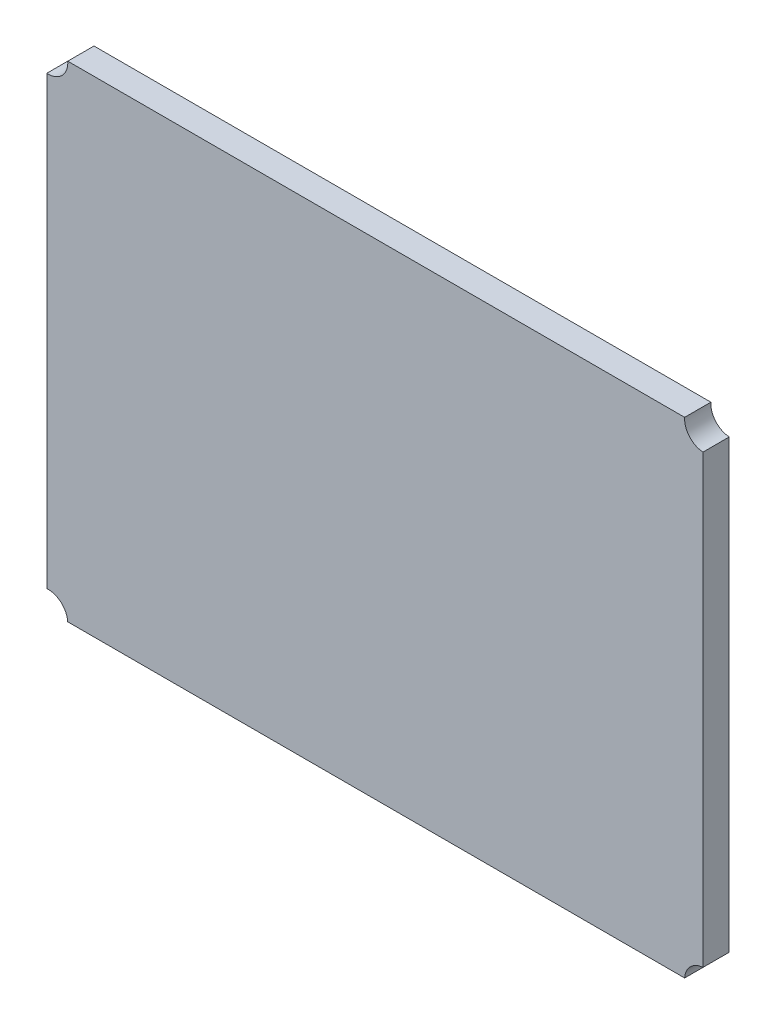
ISO-10303-21;
HEADER;
FILE_DESCRIPTION(('STEP AP214'),'2;1');
FILE_NAME('part.step','',(''),(''),'','','');
FILE_SCHEMA(('AUTOMOTIVE_DESIGN { 1 0 10303 214 1 1 1 1 }'));
ENDSEC;
DATA;
#1=APPLICATION_CONTEXT('core data for automotive mechanical design processes');
#2=APPLICATION_PROTOCOL_DEFINITION('international standard','automotive_design',2000,#1);
#3=PRODUCT_CONTEXT('',#1,'mechanical');
#4=PRODUCT('Part','Part','',(#3));
#5=PRODUCT_RELATED_PRODUCT_CATEGORY('part','',(#4));
#6=PRODUCT_DEFINITION_FORMATION('','',#4);
#7=PRODUCT_DEFINITION_CONTEXT('part definition',#1,'design');
#8=PRODUCT_DEFINITION('design','',#6,#7);
#9=PRODUCT_DEFINITION_SHAPE('','',#8);
#10=(LENGTH_UNIT() NAMED_UNIT(*) SI_UNIT(.MILLI.,.METRE.));
#11=(NAMED_UNIT(*) PLANE_ANGLE_UNIT() SI_UNIT($,.RADIAN.));
#12=(NAMED_UNIT(*) SI_UNIT($,.STERADIAN.) SOLID_ANGLE_UNIT());
#13=UNCERTAINTY_MEASURE_WITH_UNIT(LENGTH_MEASURE(1.E-05),#10,'distance_accuracy_value','');
#14=(GEOMETRIC_REPRESENTATION_CONTEXT(3) GLOBAL_UNCERTAINTY_ASSIGNED_CONTEXT((#13)) GLOBAL_UNIT_ASSIGNED_CONTEXT((#10,
#11,#12)) REPRESENTATION_CONTEXT('',''));
#15=CARTESIAN_POINT('',(0.,0.,0.));
#16=DIRECTION('',(0.,0.,1.));
#17=DIRECTION('',(1.,0.,0.));
#18=AXIS2_PLACEMENT_3D('',#15,#16,#17);
#19=CARTESIAN_POINT('',(-24.8999999999996,-18.6,2.));
#20=DIRECTION('',(0.,0.,-1.));
#21=DIRECTION('',(-1.,0.,0.));
#22=AXIS2_PLACEMENT_3D('',#19,#20,#21);
#23=CYLINDRICAL_SURFACE('',#22,1.5);
#24=CARTESIAN_POINT('',(-24.8999999999996,-18.6,0.));
#25=DIRECTION('',(0.,0.,1.));
#26=DIRECTION('',(1.,0.,0.));
#27=AXIS2_PLACEMENT_3D('',#24,#25,#26);
#28=CIRCLE('',#27,1.5);
#29=CARTESIAN_POINT('',(-23.40333704529,-18.5,0.));
#30=VERTEX_POINT('',#29);
#31=CARTESIAN_POINT('',(-25.,-17.1033370452905,0.));
#32=VERTEX_POINT('',#31);
#33=EDGE_CURVE('E130',#30,#32,#28,.T.);
#34=ORIENTED_EDGE('',*,*,#33,.F.);
#35=DIRECTION('',(0.,0.,-1.));
#36=VECTOR('',#35,1.);
#37=CARTESIAN_POINT('',(-23.40333704529,-18.5,2.));
#38=LINE('',#37,#36);
#39=CARTESIAN_POINT('',(-23.40333704529,-18.5,2.));
#40=VERTEX_POINT('',#39);
#41=EDGE_CURVE('E11',#40,#30,#38,.T.);
#42=ORIENTED_EDGE('',*,*,#41,.F.);
#43=CARTESIAN_POINT('',(-24.8999999999996,-18.6,2.));
#44=DIRECTION('',(0.,0.,1.));
#45=DIRECTION('',(1.,0.,0.));
#46=AXIS2_PLACEMENT_3D('',#43,#44,#45);
#47=CIRCLE('',#46,1.5);
#48=CARTESIAN_POINT('',(-25.,-17.1033370452905,2.));
#49=VERTEX_POINT('',#48);
#50=EDGE_CURVE('E150',#40,#49,#47,.T.);
#51=ORIENTED_EDGE('',*,*,#50,.T.);
#52=DIRECTION('',(0.,0.,-1.));
#53=VECTOR('',#52,1.);
#54=CARTESIAN_POINT('',(-25.,-17.1033370452905,2.));
#55=LINE('',#54,#53);
#56=EDGE_CURVE('E53',#49,#32,#55,.T.);
#57=ORIENTED_EDGE('',*,*,#56,.T.);
#58=EDGE_LOOP('',(#34,#42,#51,#57));
#59=FACE_BOUND('',#58,.T.);
#60=ADVANCED_FACE('F37',(#59),#23,.F.);
#61=CARTESIAN_POINT('',(0.,-18.5,2.));
#62=DIRECTION('',(0.,1.,0.));
#63=DIRECTION('',(0.,0.,1.));
#64=AXIS2_PLACEMENT_3D('',#61,#62,#63);
#65=PLANE('',#64);
#66=DIRECTION('',(1.,0.,0.));
#67=VECTOR('',#66,1.);
#68=CARTESIAN_POINT('',(0.,-18.5,0.));
#69=LINE('',#68,#67);
#70=CARTESIAN_POINT('',(23.6033370452908,-18.5,0.));
#71=VERTEX_POINT('',#70);
#72=EDGE_CURVE('E132',#30,#71,#69,.T.);
#73=ORIENTED_EDGE('',*,*,#72,.T.);
#74=DIRECTION('',(0.,0.,-1.));
#75=VECTOR('',#74,1.);
#76=CARTESIAN_POINT('',(23.6033370452908,-18.5,2.));
#77=LINE('',#76,#75);
#78=CARTESIAN_POINT('',(23.6033370452908,-18.5,2.));
#79=VERTEX_POINT('',#78);
#80=EDGE_CURVE('E45',#79,#71,#77,.T.);
#81=ORIENTED_EDGE('',*,*,#80,.F.);
#82=DIRECTION('',(1.,0.,0.));
#83=VECTOR('',#82,1.);
#84=CARTESIAN_POINT('',(0.,-18.5,2.));
#85=LINE('',#84,#83);
#86=EDGE_CURVE('E177',#40,#79,#85,.T.);
#87=ORIENTED_EDGE('',*,*,#86,.F.);
#88=ORIENTED_EDGE('',*,*,#41,.T.);
#89=EDGE_LOOP('',(#73,#81,#87,#88));
#90=FACE_BOUND('',#89,.T.);
#91=ADVANCED_FACE('F166',(#90),#65,.F.);
#92=CARTESIAN_POINT('',(25.1000000000004,-18.6,2.));
#93=DIRECTION('',(0.,0.,-1.));
#94=DIRECTION('',(-1.,0.,0.));
#95=AXIS2_PLACEMENT_3D('',#92,#93,#94);
#96=CYLINDRICAL_SURFACE('',#95,1.5);
#97=CARTESIAN_POINT('',(25.1000000000004,-18.6,0.));
#98=DIRECTION('',(0.,0.,1.));
#99=DIRECTION('',(1.,0.,0.));
#100=AXIS2_PLACEMENT_3D('',#97,#98,#99);
#101=CIRCLE('',#100,1.5);
#102=CARTESIAN_POINT('',(25.,-17.1033370452905,0.));
#103=VERTEX_POINT('',#102);
#104=EDGE_CURVE('E135',#103,#71,#101,.T.);
#105=ORIENTED_EDGE('',*,*,#104,.F.);
#106=DIRECTION('',(0.,0.,-1.));
#107=VECTOR('',#106,1.);
#108=CARTESIAN_POINT('',(25.,-17.1033370452905,2.));
#109=LINE('',#108,#107);
#110=CARTESIAN_POINT('',(25.,-17.1033370452905,2.));
#111=VERTEX_POINT('',#110);
#112=EDGE_CURVE('E156',#111,#103,#109,.T.);
#113=ORIENTED_EDGE('',*,*,#112,.F.);
#114=CARTESIAN_POINT('',(25.1000000000004,-18.6,2.));
#115=DIRECTION('',(0.,0.,1.));
#116=DIRECTION('',(1.,0.,0.));
#117=AXIS2_PLACEMENT_3D('',#114,#115,#116);
#118=CIRCLE('',#117,1.5);
#119=EDGE_CURVE('E163',#111,#79,#118,.T.);
#120=ORIENTED_EDGE('',*,*,#119,.T.);
#121=ORIENTED_EDGE('',*,*,#80,.T.);
#122=EDGE_LOOP('',(#105,#113,#120,#121));
#123=FACE_BOUND('',#122,.T.);
#124=ADVANCED_FACE('F161',(#123),#96,.F.);
#125=CARTESIAN_POINT('',(25.,0.,2.));
#126=DIRECTION('',(-1.,0.,0.));
#127=DIRECTION('',(0.,0.,1.));
#128=AXIS2_PLACEMENT_3D('',#125,#126,#127);
#129=PLANE('',#128);
#130=DIRECTION('',(0.,1.,0.));
#131=VECTOR('',#130,1.);
#132=CARTESIAN_POINT('',(25.,0.,0.));
#133=LINE('',#132,#131);
#134=CARTESIAN_POINT('',(25.,16.9033370452904,0.));
#135=VERTEX_POINT('',#134);
#136=EDGE_CURVE('E138',#103,#135,#133,.T.);
#137=ORIENTED_EDGE('',*,*,#136,.T.);
#138=DIRECTION('',(0.,0.,-1.));
#139=VECTOR('',#138,1.);
#140=CARTESIAN_POINT('',(25.,16.9033370452904,2.));
#141=LINE('',#140,#139);
#142=CARTESIAN_POINT('',(25.,16.9033370452904,2.));
#143=VERTEX_POINT('',#142);
#144=EDGE_CURVE('E154',#143,#135,#141,.T.);
#145=ORIENTED_EDGE('',*,*,#144,.F.);
#146=DIRECTION('',(0.,1.,0.));
#147=VECTOR('',#146,1.);
#148=CARTESIAN_POINT('',(25.,0.,2.));
#149=LINE('',#148,#147);
#150=EDGE_CURVE('E175',#111,#143,#149,.T.);
#151=ORIENTED_EDGE('',*,*,#150,.F.);
#152=ORIENTED_EDGE('',*,*,#112,.T.);
#153=EDGE_LOOP('',(#137,#145,#151,#152));
#154=FACE_BOUND('',#153,.T.);
#155=ADVANCED_FACE('F173',(#154),#129,.F.);
#156=CARTESIAN_POINT('',(25.1,18.4,2.));
#157=DIRECTION('',(0.,0.,-1.));
#158=DIRECTION('',(-1.,0.,0.));
#159=AXIS2_PLACEMENT_3D('',#156,#157,#158);
#160=CYLINDRICAL_SURFACE('',#159,1.5);
#161=CARTESIAN_POINT('',(25.1,18.4,0.));
#162=DIRECTION('',(0.,0.,1.));
#163=DIRECTION('',(1.,0.,0.));
#164=AXIS2_PLACEMENT_3D('',#161,#162,#163);
#165=CIRCLE('',#164,1.5);
#166=CARTESIAN_POINT('',(23.6033370452904,18.5,0.));
#167=VERTEX_POINT('',#166);
#168=EDGE_CURVE('E141',#167,#135,#165,.T.);
#169=ORIENTED_EDGE('',*,*,#168,.F.);
#170=DIRECTION('',(0.,0.,-1.));
#171=VECTOR('',#170,1.);
#172=CARTESIAN_POINT('',(23.6033370452904,18.5,2.));
#173=LINE('',#172,#171);
#174=CARTESIAN_POINT('',(23.6033370452904,18.5,2.));
#175=VERTEX_POINT('',#174);
#176=EDGE_CURVE('E112',#175,#167,#173,.T.);
#177=ORIENTED_EDGE('',*,*,#176,.F.);
#178=CARTESIAN_POINT('',(25.1,18.4,2.));
#179=DIRECTION('',(0.,0.,1.));
#180=DIRECTION('',(1.,0.,0.));
#181=AXIS2_PLACEMENT_3D('',#178,#179,#180);
#182=CIRCLE('',#181,1.5);
#183=EDGE_CURVE('E122',#175,#143,#182,.T.);
#184=ORIENTED_EDGE('',*,*,#183,.T.);
#185=ORIENTED_EDGE('',*,*,#144,.T.);
#186=EDGE_LOOP('',(#169,#177,#184,#185));
#187=FACE_BOUND('',#186,.T.);
#188=ADVANCED_FACE('F182',(#187),#160,.F.);
#189=CARTESIAN_POINT('',(0.,18.5,2.));
#190=DIRECTION('',(0.,1.,0.));
#191=DIRECTION('',(0.,0.,1.));
#192=AXIS2_PLACEMENT_3D('',#189,#190,#191);
#193=PLANE('',#192);
#194=DIRECTION('',(1.,0.,0.));
#195=VECTOR('',#194,1.);
#196=CARTESIAN_POINT('',(0.,18.5,0.));
#197=LINE('',#196,#195);
#198=CARTESIAN_POINT('',(-23.4033370452904,18.5,0.));
#199=VERTEX_POINT('',#198);
#200=EDGE_CURVE('E108',#199,#167,#197,.T.);
#201=ORIENTED_EDGE('',*,*,#200,.F.);
#202=DIRECTION('',(0.,0.,-1.));
#203=VECTOR('',#202,1.);
#204=CARTESIAN_POINT('',(-23.4033370452904,18.5,2.));
#205=LINE('',#204,#203);
#206=CARTESIAN_POINT('',(-23.4033370452904,18.5,2.));
#207=VERTEX_POINT('',#206);
#208=EDGE_CURVE('E103',#207,#199,#205,.T.);
#209=ORIENTED_EDGE('',*,*,#208,.F.);
#210=DIRECTION('',(1.,0.,0.));
#211=VECTOR('',#210,1.);
#212=CARTESIAN_POINT('',(0.,18.5,2.));
#213=LINE('',#212,#211);
#214=EDGE_CURVE('E106',#207,#175,#213,.T.);
#215=ORIENTED_EDGE('',*,*,#214,.T.);
#216=ORIENTED_EDGE('',*,*,#176,.T.);
#217=EDGE_LOOP('',(#201,#209,#215,#216));
#218=FACE_BOUND('',#217,.T.);
#219=ADVANCED_FACE('F105',(#218),#193,.T.);
#220=CARTESIAN_POINT('',(-24.9,18.4,2.));
#221=DIRECTION('',(0.,0.,-1.));
#222=DIRECTION('',(-1.,0.,0.));
#223=AXIS2_PLACEMENT_3D('',#220,#221,#222);
#224=CYLINDRICAL_SURFACE('',#223,1.5);
#225=CARTESIAN_POINT('',(-24.9,18.4,0.));
#226=DIRECTION('',(0.,0.,1.));
#227=DIRECTION('',(1.,0.,0.));
#228=AXIS2_PLACEMENT_3D('',#225,#226,#227);
#229=CIRCLE('',#228,1.5);
#230=CARTESIAN_POINT('',(-25.,16.9033370452904,0.));
#231=VERTEX_POINT('',#230);
#232=EDGE_CURVE('E145',#231,#199,#229,.T.);
#233=ORIENTED_EDGE('',*,*,#232,.F.);
#234=DIRECTION('',(0.,0.,-1.));
#235=VECTOR('',#234,1.);
#236=CARTESIAN_POINT('',(-25.,16.9033370452904,2.));
#237=LINE('',#236,#235);
#238=CARTESIAN_POINT('',(-25.,16.9033370452904,2.));
#239=VERTEX_POINT('',#238);
#240=EDGE_CURVE('E78',#239,#231,#237,.T.);
#241=ORIENTED_EDGE('',*,*,#240,.F.);
#242=CARTESIAN_POINT('',(-24.9,18.4,2.));
#243=DIRECTION('',(0.,0.,1.));
#244=DIRECTION('',(1.,0.,0.));
#245=AXIS2_PLACEMENT_3D('',#242,#243,#244);
#246=CIRCLE('',#245,1.5);
#247=EDGE_CURVE('E120',#239,#207,#246,.T.);
#248=ORIENTED_EDGE('',*,*,#247,.T.);
#249=ORIENTED_EDGE('',*,*,#208,.T.);
#250=EDGE_LOOP('',(#233,#241,#248,#249));
#251=FACE_BOUND('',#250,.T.);
#252=ADVANCED_FACE('F124',(#251),#224,.F.);
#253=CARTESIAN_POINT('',(-25.,0.,2.));
#254=DIRECTION('',(-1.,0.,0.));
#255=DIRECTION('',(0.,0.,1.));
#256=AXIS2_PLACEMENT_3D('',#253,#254,#255);
#257=PLANE('',#256);
#258=DIRECTION('',(0.,1.,0.));
#259=VECTOR('',#258,1.);
#260=CARTESIAN_POINT('',(-25.,0.,0.));
#261=LINE('',#260,#259);
#262=EDGE_CURVE('E147',#32,#231,#261,.T.);
#263=ORIENTED_EDGE('',*,*,#262,.F.);
#264=ORIENTED_EDGE('',*,*,#56,.F.);
#265=DIRECTION('',(0.,1.,0.));
#266=VECTOR('',#265,1.);
#267=CARTESIAN_POINT('',(-25.,0.,2.));
#268=LINE('',#267,#266);
#269=EDGE_CURVE('E125',#49,#239,#268,.T.);
#270=ORIENTED_EDGE('',*,*,#269,.T.);
#271=ORIENTED_EDGE('',*,*,#240,.T.);
#272=EDGE_LOOP('',(#263,#264,#270,#271));
#273=FACE_BOUND('',#272,.T.);
#274=ADVANCED_FACE('F183',(#273),#257,.T.);
#275=CARTESIAN_POINT('',(0.,0.,2.));
#276=DIRECTION('',(0.,0.,1.));
#277=DIRECTION('',(1.,0.,0.));
#278=AXIS2_PLACEMENT_3D('',#275,#276,#277);
#279=PLANE('',#278);
#280=ORIENTED_EDGE('',*,*,#50,.F.);
#281=ORIENTED_EDGE('',*,*,#86,.T.);
#282=ORIENTED_EDGE('',*,*,#119,.F.);
#283=ORIENTED_EDGE('',*,*,#150,.T.);
#284=ORIENTED_EDGE('',*,*,#183,.F.);
#285=ORIENTED_EDGE('',*,*,#214,.F.);
#286=ORIENTED_EDGE('',*,*,#247,.F.);
#287=ORIENTED_EDGE('',*,*,#269,.F.);
#288=EDGE_LOOP('',(#280,#281,#282,#283,#284,#285,#286,#287));
#289=FACE_BOUND('',#288,.T.);
#290=ADVANCED_FACE('F118',(#289),#279,.T.);
#291=CARTESIAN_POINT('',(0.,0.,0.));
#292=DIRECTION('',(0.,0.,1.));
#293=DIRECTION('',(1.,0.,0.));
#294=AXIS2_PLACEMENT_3D('',#291,#292,#293);
#295=PLANE('',#294);
#296=ORIENTED_EDGE('',*,*,#33,.T.);
#297=ORIENTED_EDGE('',*,*,#262,.T.);
#298=ORIENTED_EDGE('',*,*,#232,.T.);
#299=ORIENTED_EDGE('',*,*,#200,.T.);
#300=ORIENTED_EDGE('',*,*,#168,.T.);
#301=ORIENTED_EDGE('',*,*,#136,.F.);
#302=ORIENTED_EDGE('',*,*,#104,.T.);
#303=ORIENTED_EDGE('',*,*,#72,.F.);
#304=EDGE_LOOP('',(#296,#297,#298,#299,#300,#301,#302,#303));
#305=FACE_BOUND('',#304,.T.);
#306=ADVANCED_FACE('F169',(#305),#295,.F.);
#307=CLOSED_SHELL('',(#60,#91,#124,#155,#188,#219,#252,#274,#290,#306));
#308=MANIFOLD_SOLID_BREP('B2',#307);
#309=ADVANCED_BREP_SHAPE_REPRESENTATION('',(#18,#308),#14);
#310=SHAPE_DEFINITION_REPRESENTATION(#9,#309);
ENDSEC;
END-ISO-10303-21;
